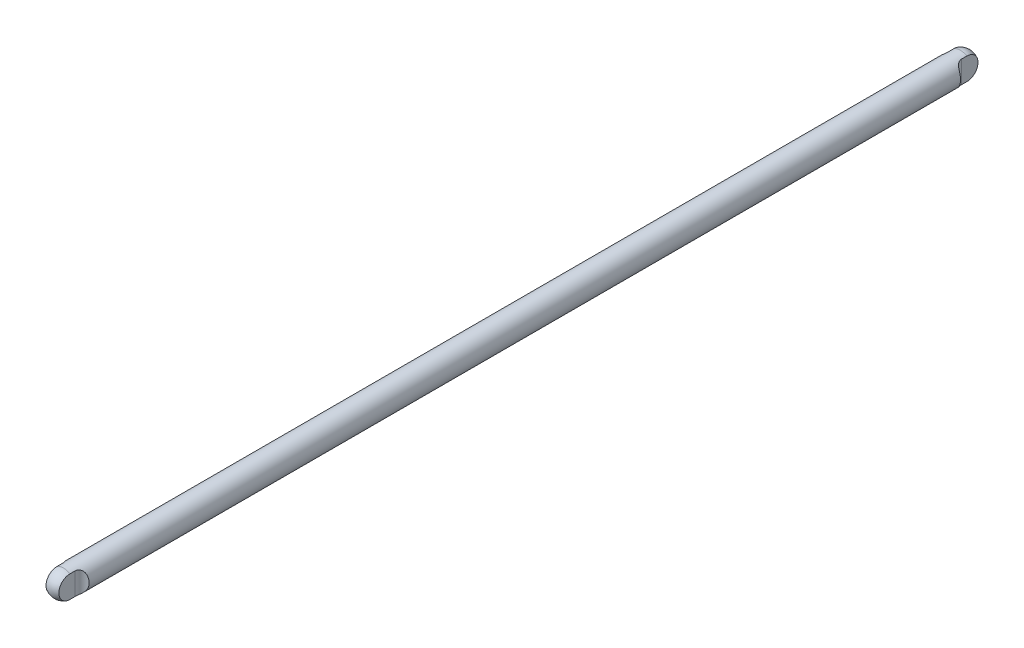
ISO-10303-21;
HEADER;
FILE_DESCRIPTION(('STEP AP214'),'2;1');
FILE_NAME('part.step','',(''),(''),'','','');
FILE_SCHEMA(('AUTOMOTIVE_DESIGN { 1 0 10303 214 1 1 1 1 }'));
ENDSEC;
DATA;
#1=APPLICATION_CONTEXT('core data for automotive mechanical design processes');
#2=APPLICATION_PROTOCOL_DEFINITION('international standard','automotive_design',2000,#1);
#3=PRODUCT_CONTEXT('',#1,'mechanical');
#4=PRODUCT('Part','Part','',(#3));
#5=PRODUCT_RELATED_PRODUCT_CATEGORY('part','',(#4));
#6=PRODUCT_DEFINITION_FORMATION('','',#4);
#7=PRODUCT_DEFINITION_CONTEXT('part definition',#1,'design');
#8=PRODUCT_DEFINITION('design','',#6,#7);
#9=PRODUCT_DEFINITION_SHAPE('','',#8);
#10=(LENGTH_UNIT() NAMED_UNIT(*) SI_UNIT(.MILLI.,.METRE.));
#11=(NAMED_UNIT(*) PLANE_ANGLE_UNIT() SI_UNIT($,.RADIAN.));
#12=(NAMED_UNIT(*) SI_UNIT($,.STERADIAN.) SOLID_ANGLE_UNIT());
#13=UNCERTAINTY_MEASURE_WITH_UNIT(LENGTH_MEASURE(1.E-05),#10,'distance_accuracy_value','');
#14=(GEOMETRIC_REPRESENTATION_CONTEXT(3) GLOBAL_UNCERTAINTY_ASSIGNED_CONTEXT((#13)) GLOBAL_UNIT_ASSIGNED_CONTEXT((#10,
#11,#12)) REPRESENTATION_CONTEXT('',''));
#15=CARTESIAN_POINT('',(0.,0.,0.));
#16=DIRECTION('',(0.,0.,1.));
#17=DIRECTION('',(1.,0.,0.));
#18=AXIS2_PLACEMENT_3D('',#15,#16,#17);
#19=CARTESIAN_POINT('',(0.,0.,349.1));
#20=DIRECTION('',(0.,0.,-1.));
#21=DIRECTION('',(-1.,0.,0.));
#22=AXIS2_PLACEMENT_3D('',#19,#20,#21);
#23=CYLINDRICAL_SURFACE('',#22,5.);
#24=DIRECTION('',(0.,0.,-1.));
#25=VECTOR('',#24,1.);
#26=CARTESIAN_POINT('',(2.5,-4.33012701892219,349.1));
#27=LINE('',#26,#25);
#28=CARTESIAN_POINT('',(2.5,-4.33012701892219,0.));
#29=VERTEX_POINT('',#28);
#30=CARTESIAN_POINT('',(2.5,-4.33012701892219,2.));
#31=VERTEX_POINT('',#30);
#32=EDGE_CURVE('E175',#29,#31,#27,.F.);
#33=ORIENTED_EDGE('',*,*,#32,.T.);
#34=CARTESIAN_POINT('',(2.5,-4.33012701892219,2.));
#35=CARTESIAN_POINT('',(2.49998890838741,-4.33011975918916,2.07286931336377));
#36=CARTESIAN_POINT('',(2.50265481474662,-4.32859389415641,2.14573595838383));
#37=CARTESIAN_POINT('',(2.51325772717459,-4.32245352122361,2.29095305502206));
#38=CARTESIAN_POINT('',(2.52119467837085,-4.31783904547655,2.36330351200592));
#39=CARTESIAN_POINT('',(2.54224982124621,-4.30547411184621,2.50693139415062));
#40=CARTESIAN_POINT('',(2.55536458210148,-4.29772573041024,2.57820949745524));
#41=CARTESIAN_POINT('',(2.58658931625948,-4.27900500507376,2.71920942895226));
#42=CARTESIAN_POINT('',(2.60469916857561,-4.26803273925885,2.78893129479424));
#43=CARTESIAN_POINT('',(2.66623556276672,-4.23007687808605,2.99513359796381));
#44=CARTESIAN_POINT('',(2.71686994066779,-4.19805367549162,3.12865739977181));
#45=CARTESIAN_POINT('',(2.83440227440243,-4.11960085236087,3.38358572054123));
#46=CARTESIAN_POINT('',(2.90129072758782,-4.07317964498852,3.50499726242607));
#47=CARTESIAN_POINT('',(3.04699289938735,-3.96534772585139,3.73231057695749));
#48=CARTESIAN_POINT('',(3.12575754221803,-3.90399809021093,3.83827280126846));
#49=CARTESIAN_POINT('',(3.29052014288885,-3.76616361967157,4.03335343987623));
#50=CARTESIAN_POINT('',(3.37651972438131,-3.68967538215664,4.12246805861374));
#51=CARTESIAN_POINT('',(3.55391210519017,-3.51928667337122,4.28645880636708));
#52=CARTESIAN_POINT('',(3.64538618990454,-3.42484054733495,4.36067521289881));
#53=CARTESIAN_POINT('',(3.82560456461646,-3.22228643681375,4.49175652627476));
#54=CARTESIAN_POINT('',(3.91434718350423,-3.11417028777206,4.54861099364463));
#55=CARTESIAN_POINT('',(4.06065278385769,-2.919153446362,4.63310374259887));
#56=CARTESIAN_POINT('',(4.11986962891962,-2.83503839357838,4.66444658606962));
#57=CARTESIAN_POINT('',(4.23390907705447,-2.66172259127331,4.72048729166151));
#58=CARTESIAN_POINT('',(4.28873006020074,-2.57251998746377,4.7451827119589));
#59=CARTESIAN_POINT('',(4.39324824982699,-2.38966226213723,4.78896360520669));
#60=CARTESIAN_POINT('',(4.44293698688549,-2.29600014198939,4.80803989836677));
#61=CARTESIAN_POINT('',(4.5365293918425,-2.1050433198745,4.84151264013937));
#62=CARTESIAN_POINT('',(4.58043352986605,-2.00774891393584,4.85590946920025));
#63=CARTESIAN_POINT('',(4.66287786393817,-1.80816501162143,4.88116695517961));
#64=CARTESIAN_POINT('',(4.70129351786299,-1.70581457761703,4.89195130225977));
#65=CARTESIAN_POINT('',(4.77140297442368,-1.49856073833942,4.91040545996588));
#66=CARTESIAN_POINT('',(4.80309619925755,-1.39365711447918,4.91807500292193));
#67=CARTESIAN_POINT('',(4.85952213794237,-1.18196065305939,4.93097708141289));
#68=CARTESIAN_POINT('',(4.88426176489115,-1.07516980483367,4.93621204076625));
#69=CARTESIAN_POINT('',(4.92667931168756,-0.860142880724481,4.94478607840418));
#70=CARTESIAN_POINT('',(4.94435779994534,-0.751906921895223,4.94812530930094));
#71=CARTESIAN_POINT('',(4.98200416493772,-0.461643601750666,4.95504556143226));
#72=CARTESIAN_POINT('',(4.99558372534604,-0.278717643035531,4.95729230473269));
#73=CARTESIAN_POINT('',(5.00258969913283,0.0875941668334869,4.95847844105652));
#74=CARTESIAN_POINT('',(4.99600800692065,0.270980173330969,4.95741650386152));
#75=CARTESIAN_POINT('',(4.96788288054121,0.579909917020618,4.95245038238301));
#76=CARTESIAN_POINT('',(4.95153983760421,0.705965186304049,4.94951643058023));
#77=CARTESIAN_POINT('',(4.90931314620836,0.95643621803914,4.94135312139897));
#78=CARTESIAN_POINT('',(4.88342740985525,1.08085161552009,4.93612326163934));
#79=CARTESIAN_POINT('',(4.82228758228391,1.32727971597429,4.9226160495179));
#80=CARTESIAN_POINT('',(4.78702730113114,1.44929077399684,4.91433668219431));
#81=CARTESIAN_POINT('',(4.70744994793621,1.68996101116523,4.89370956817255));
#82=CARTESIAN_POINT('',(4.66313477271953,1.80862088640329,4.88136267321175));
#83=CARTESIAN_POINT('',(4.57383870623748,2.02266390863234,4.85377535119704));
#84=CARTESIAN_POINT('',(4.53014423069972,2.11868798429218,4.83933484073116));
#85=CARTESIAN_POINT('',(4.4371340492809,2.30713626106005,4.8058438464872));
#86=CARTESIAN_POINT('',(4.38781938985173,2.39956112803791,4.78679422016546));
#87=CARTESIAN_POINT('',(4.28418192565815,2.58003656984942,4.74316257330849));
#88=CARTESIAN_POINT('',(4.22986663932654,2.66809341488229,4.71858878066347));
#89=CARTESIAN_POINT('',(4.11695515446838,2.83922589081871,4.66292080401462));
#90=CARTESIAN_POINT('',(4.05835999681569,2.92230272398227,4.63182820198133));
#91=CARTESIAN_POINT('',(3.90291532968622,3.12925861418026,4.54193061254306));
#92=CARTESIAN_POINT('',(3.80355543688568,3.24892003284708,4.4775023769547));
#93=CARTESIAN_POINT('',(3.60203769768729,3.47098996337275,4.32668739870024));
#94=CARTESIAN_POINT('',(3.49988150682769,3.57340843755407,4.2403134083514));
#95=CARTESIAN_POINT('',(3.34974774028792,3.71267559127453,4.09318082396465));
#96=CARTESIAN_POINT('',(3.30002753755786,3.75685190332047,4.0409637131228));
#97=CARTESIAN_POINT('',(3.20274304260355,3.84011951962084,3.93080258866227));
#98=CARTESIAN_POINT('',(3.15517777842065,3.87921313154574,3.87286119518595));
#99=CARTESIAN_POINT('',(3.06318120877645,3.95226256007617,3.75148829460892));
#100=CARTESIAN_POINT('',(3.01875030213194,3.98621772349087,3.68805609113419));
#101=CARTESIAN_POINT('',(2.93397379754708,4.04902189933137,3.55617047051652));
#102=CARTESIAN_POINT('',(2.89362771797114,4.0778715140452,3.48771764699217));
#103=CARTESIAN_POINT('',(2.78866019712116,4.15091266051016,3.29179521959217));
#104=CARTESIAN_POINT('',(2.72925460124386,4.18982276345876,3.15945205454181));
#105=CARTESIAN_POINT('',(2.62964362505587,4.25305647096754,2.88455644879689));
#106=CARTESIAN_POINT('',(2.58942933216935,4.27738684779975,2.74200878258537));
#107=CARTESIAN_POINT('',(2.54007860241238,4.30680074197868,2.49882771096457));
#108=CARTESIAN_POINT('',(2.52507536549459,4.31557944456009,2.39977873925277));
#109=CARTESIAN_POINT('',(2.5050279075174,4.32722457844035,2.20049865292886));
#110=CARTESIAN_POINT('',(2.49996745460086,4.3301006462887,2.10026973422495));
#111=CARTESIAN_POINT('',(2.5,4.33012701892219,2.));
#112=B_SPLINE_CURVE_WITH_KNOTS('',3,(#34,#35,#36,#37,#38,#39,#40,#41,#42,#43,#44,#45,#46,#47,
#48,#49,#50,#51,#52,#53,#54,#55,#56,#57,#58,#59,#60,#61,#62,#63,#64,#65,#66,#67,#68,#69,#70,#71,
#72,#73,#74,#75,#76,#77,#78,#79,#80,#81,#82,#83,#84,#85,#86,#87,#88,#89,#90,#91,#92,#93,#94,#95,
#96,#97,#98,#99,#100,#101,#102,#103,#104,#105,#106,#107,#108,#109,#110,#111),.UNSPECIFIED.,.F.,
.F.,(4,2,2,2,2,2,2,2,2,2,2,2,2,2,2,2,2,2,2,2,2,2,2,2,2,2,2,2,2,2,2,2,2,2,2,2,2,2,4),(0.,
0.218538284869025,0.437074294751238,0.655465744738902,0.873851905510304,1.31060421849003,
1.74710180393741,2.18184273331704,2.61668148809694,3.06783629085049,3.51926183451306,
3.84147094255838,4.16379824790588,4.4866492453154,4.80947398782153,5.1387416935797,
5.46803768889111,5.79700513873042,6.12594610188647,6.67506732433646,7.2244093433822,
7.6054845080682,7.98664309965389,8.36805399486516,8.74938507361984,9.06854671962465,
9.3876490360193,9.70627918259163,10.0248320940086,10.5277774805773,11.0304312795866,
11.2837910871098,11.5370354583472,11.7903119945858,12.0435586325186,12.4917160669609,
12.9396651709179,13.240717680691,13.5412783045895),.UNSPECIFIED.);
#113=CARTESIAN_POINT('',(2.5,4.33012701892219,2.));
#114=VERTEX_POINT('',#113);
#115=EDGE_CURVE('E163',#31,#114,#112,.T.);
#116=ORIENTED_EDGE('',*,*,#115,.T.);
#117=DIRECTION('',(0.,0.,-1.));
#118=VECTOR('',#117,1.);
#119=CARTESIAN_POINT('',(2.5,4.33012701892219,349.1));
#120=LINE('',#119,#118);
#121=CARTESIAN_POINT('',(2.5,4.33012701892219,0.));
#122=VERTEX_POINT('',#121);
#123=EDGE_CURVE('E178',#114,#122,#120,.T.);
#124=ORIENTED_EDGE('',*,*,#123,.T.);
#125=CARTESIAN_POINT('',(0.,0.,0.));
#126=DIRECTION('',(0.,0.,1.));
#127=DIRECTION('',(1.,0.,0.));
#128=AXIS2_PLACEMENT_3D('',#125,#126,#127);
#129=CIRCLE('',#128,5.);
#130=CARTESIAN_POINT('',(-2.5,4.33012701892219,0.));
#131=VERTEX_POINT('',#130);
#132=EDGE_CURVE('E186',#122,#131,#129,.T.);
#133=ORIENTED_EDGE('',*,*,#132,.T.);
#134=DIRECTION('',(0.,0.,-1.));
#135=VECTOR('',#134,1.);
#136=CARTESIAN_POINT('',(-2.5,4.33012701892219,349.1));
#137=LINE('',#136,#135);
#138=CARTESIAN_POINT('',(-2.5,4.33012701892219,2.));
#139=VERTEX_POINT('',#138);
#140=EDGE_CURVE('E185',#139,#131,#137,.T.);
#141=ORIENTED_EDGE('',*,*,#140,.F.);
#142=CARTESIAN_POINT('',(-2.5,4.33012701892219,2.));
#143=CARTESIAN_POINT('',(-2.49998890838741,4.33011975918916,2.07286931336377));
#144=CARTESIAN_POINT('',(-2.50265481474662,4.32859389415641,2.14573595838383));
#145=CARTESIAN_POINT('',(-2.51325772717459,4.32245352122361,2.29095305502206));
#146=CARTESIAN_POINT('',(-2.52119467837085,4.31783904547655,2.36330351200592));
#147=CARTESIAN_POINT('',(-2.54224982124621,4.30547411184621,2.50693139415062));
#148=CARTESIAN_POINT('',(-2.55536458210148,4.29772573041024,2.57820949745524));
#149=CARTESIAN_POINT('',(-2.58658931625948,4.27900500507376,2.71920942895226));
#150=CARTESIAN_POINT('',(-2.60469916857561,4.26803273925885,2.78893129479424));
#151=CARTESIAN_POINT('',(-2.66623556276672,4.23007687808605,2.99513359796381));
#152=CARTESIAN_POINT('',(-2.71686994066779,4.19805367549162,3.12865739977181));
#153=CARTESIAN_POINT('',(-2.83440227440243,4.11960085236087,3.38358572054123));
#154=CARTESIAN_POINT('',(-2.90129072758782,4.07317964498852,3.50499726242607));
#155=CARTESIAN_POINT('',(-3.04699289938735,3.96534772585139,3.73231057695749));
#156=CARTESIAN_POINT('',(-3.12575754221803,3.90399809021093,3.83827280126846));
#157=CARTESIAN_POINT('',(-3.29052014288885,3.76616361967157,4.03335343987623));
#158=CARTESIAN_POINT('',(-3.37651972438131,3.68967538215664,4.12246805861374));
#159=CARTESIAN_POINT('',(-3.55391210519017,3.51928667337122,4.28645880636708));
#160=CARTESIAN_POINT('',(-3.64538618990454,3.42484054733495,4.36067521289881));
#161=CARTESIAN_POINT('',(-3.82560456461646,3.22228643681375,4.49175652627476));
#162=CARTESIAN_POINT('',(-3.91434718350423,3.11417028777206,4.54861099364463));
#163=CARTESIAN_POINT('',(-4.06065278385769,2.919153446362,4.63310374259887));
#164=CARTESIAN_POINT('',(-4.11986962891962,2.83503839357838,4.66444658606962));
#165=CARTESIAN_POINT('',(-4.23390907705447,2.66172259127331,4.72048729166151));
#166=CARTESIAN_POINT('',(-4.28873006020074,2.57251998746377,4.7451827119589));
#167=CARTESIAN_POINT('',(-4.39324824982699,2.38966226213723,4.78896360520669));
#168=CARTESIAN_POINT('',(-4.44293698688549,2.29600014198939,4.80803989836677));
#169=CARTESIAN_POINT('',(-4.5365293918425,2.1050433198745,4.84151264013937));
#170=CARTESIAN_POINT('',(-4.58043352986605,2.00774891393584,4.85590946920025));
#171=CARTESIAN_POINT('',(-4.66287786393817,1.80816501162143,4.88116695517961));
#172=CARTESIAN_POINT('',(-4.70129351786299,1.70581457761703,4.89195130225977));
#173=CARTESIAN_POINT('',(-4.77140297442368,1.49856073833942,4.91040545996588));
#174=CARTESIAN_POINT('',(-4.80309619925755,1.39365711447918,4.91807500292193));
#175=CARTESIAN_POINT('',(-4.85952213794237,1.18196065305939,4.93097708141289));
#176=CARTESIAN_POINT('',(-4.88426176489115,1.07516980483367,4.93621204076625));
#177=CARTESIAN_POINT('',(-4.92667931168756,0.86014288072448,4.94478607840418));
#178=CARTESIAN_POINT('',(-4.94435779994534,0.751906921895222,4.94812530930094));
#179=CARTESIAN_POINT('',(-4.98200416493772,0.461643601750665,4.95504556143226));
#180=CARTESIAN_POINT('',(-4.99558372534604,0.27871764303553,4.9572923047327));
#181=CARTESIAN_POINT('',(-5.00258969913283,-0.0875941668334893,4.95847844105652));
#182=CARTESIAN_POINT('',(-4.99600800692065,-0.270980173330972,4.95741650386152));
#183=CARTESIAN_POINT('',(-4.96788288054121,-0.579909917020621,4.95245038238301));
#184=CARTESIAN_POINT('',(-4.95153983760421,-0.705965186304052,4.94951643058023));
#185=CARTESIAN_POINT('',(-4.90931314620836,-0.956436218039144,4.94135312139897));
#186=CARTESIAN_POINT('',(-4.88342740985525,-1.08085161552009,4.93612326163934));
#187=CARTESIAN_POINT('',(-4.82228758228391,-1.32727971597429,4.9226160495179));
#188=CARTESIAN_POINT('',(-4.78702730113114,-1.44929077399685,4.91433668219431));
#189=CARTESIAN_POINT('',(-4.70744994793621,-1.68996101116524,4.89370956817255));
#190=CARTESIAN_POINT('',(-4.66313477271953,-1.80862088640329,4.88136267321175));
#191=CARTESIAN_POINT('',(-4.57383870623748,-2.02266390863235,4.85377535119704));
#192=CARTESIAN_POINT('',(-4.53014423069972,-2.11868798429218,4.83933484073116));
#193=CARTESIAN_POINT('',(-4.4371340492809,-2.30713626106005,4.8058438464872));
#194=CARTESIAN_POINT('',(-4.38781938985173,-2.39956112803791,4.78679422016546));
#195=CARTESIAN_POINT('',(-4.28418192565815,-2.58003656984943,4.7431625733085));
#196=CARTESIAN_POINT('',(-4.22986663932653,-2.6680934148823,4.71858878066347));
#197=CARTESIAN_POINT('',(-4.11695515446838,-2.83922589081872,4.66292080401462));
#198=CARTESIAN_POINT('',(-4.05835999681569,-2.92230272398227,4.63182820198133));
#199=CARTESIAN_POINT('',(-3.90291532968622,-3.12925861418026,4.54193061254306));
#200=CARTESIAN_POINT('',(-3.80355543688568,-3.24892003284708,4.4775023769547));
#201=CARTESIAN_POINT('',(-3.60203769768728,-3.47098996337275,4.32668739870024));
#202=CARTESIAN_POINT('',(-3.49988150682769,-3.57340843755407,4.2403134083514));
#203=CARTESIAN_POINT('',(-3.34974774028792,-3.71267559127453,4.09318082396465));
#204=CARTESIAN_POINT('',(-3.30002753755786,-3.75685190332048,4.0409637131228));
#205=CARTESIAN_POINT('',(-3.20274304260354,-3.84011951962085,3.93080258866227));
#206=CARTESIAN_POINT('',(-3.15517777842065,-3.87921313154574,3.87286119518594));
#207=CARTESIAN_POINT('',(-3.06318120877645,-3.95226256007617,3.75148829460891));
#208=CARTESIAN_POINT('',(-3.01875030213194,-3.98621772349087,3.68805609113418));
#209=CARTESIAN_POINT('',(-2.93397379754708,-4.04902189933137,3.55617047051652));
#210=CARTESIAN_POINT('',(-2.89362771797114,-4.0778715140452,3.48771764699216));
#211=CARTESIAN_POINT('',(-2.78866019712116,-4.15091266051016,3.29179521959217));
#212=CARTESIAN_POINT('',(-2.72925460124385,-4.18982276345876,3.1594520545418));
#213=CARTESIAN_POINT('',(-2.62964362505587,-4.25305647096754,2.88455644879689));
#214=CARTESIAN_POINT('',(-2.58942933216935,-4.27738684779975,2.74200878258536));
#215=CARTESIAN_POINT('',(-2.54007860241238,-4.30680074197868,2.49882771096457));
#216=CARTESIAN_POINT('',(-2.52507536549459,-4.31557944456009,2.39977873925276));
#217=CARTESIAN_POINT('',(-2.5050279075174,-4.32722457844035,2.20049865292886));
#218=CARTESIAN_POINT('',(-2.49996745460086,-4.3301006462887,2.10026973422495));
#219=CARTESIAN_POINT('',(-2.5,-4.33012701892219,2.));
#220=B_SPLINE_CURVE_WITH_KNOTS('',3,(#142,#143,#144,#145,#146,#147,#148,#149,#150,#151,#152,
#153,#154,#155,#156,#157,#158,#159,#160,#161,#162,#163,#164,#165,#166,#167,#168,#169,#170,#171,
#172,#173,#174,#175,#176,#177,#178,#179,#180,#181,#182,#183,#184,#185,#186,#187,#188,#189,#190,
#191,#192,#193,#194,#195,#196,#197,#198,#199,#200,#201,#202,#203,#204,#205,#206,#207,#208,#209,
#210,#211,#212,#213,#214,#215,#216,#217,#218,#219),.UNSPECIFIED.,.F.,.F.,(4,2,2,2,2,2,2,2,2,2,2,
2,2,2,2,2,2,2,2,2,2,2,2,2,2,2,2,2,2,2,2,2,2,2,2,2,2,2,4),(0.,0.218538284869025,
0.437074294751238,0.655465744738902,0.873851905510304,1.31060421849003,1.74710180393741,
2.18184273331704,2.61668148809694,3.06783629085049,3.51926183451306,3.84147094255838,
4.16379824790588,4.4866492453154,4.80947398782153,5.1387416935797,5.4680376888911,
5.79700513873042,6.12594610188647,6.67506732433646,7.2244093433822,7.6054845080682,
7.98664309965389,8.36805399486516,8.74938507361984,9.06854671962465,9.3876490360193,
9.70627918259163,10.0248320940086,10.5277774805773,11.0304312795866,11.2837910871098,
11.5370354583472,11.7903119945858,12.0435586325186,12.4917160669609,12.9396651709179,
13.240717680691,13.5412783045895),.UNSPECIFIED.);
#221=CARTESIAN_POINT('',(-2.5,-4.33012701892219,2.));
#222=VERTEX_POINT('',#221);
#223=EDGE_CURVE('E140',#139,#222,#220,.T.);
#224=ORIENTED_EDGE('',*,*,#223,.T.);
#225=DIRECTION('',(0.,0.,-1.));
#226=VECTOR('',#225,1.);
#227=CARTESIAN_POINT('',(-2.5,-4.33012701892219,349.1));
#228=LINE('',#227,#226);
#229=CARTESIAN_POINT('',(-2.5,-4.33012701892219,0.));
#230=VERTEX_POINT('',#229);
#231=EDGE_CURVE('E183',#230,#222,#228,.F.);
#232=ORIENTED_EDGE('',*,*,#231,.F.);
#233=EDGE_CURVE('E131',#230,#29,#129,.T.);
#234=ORIENTED_EDGE('',*,*,#233,.T.);
#235=EDGE_LOOP('',(#33,#116,#124,#133,#141,#224,#232,#234));
#236=FACE_BOUND('',#235,.T.);
#237=DIRECTION('',(0.,0.,-1.));
#238=VECTOR('',#237,1.);
#239=CARTESIAN_POINT('',(-2.5,4.33012701892219,349.1));
#240=LINE('',#239,#238);
#241=CARTESIAN_POINT('',(-2.5,4.33012701892219,349.1));
#242=VERTEX_POINT('',#241);
#243=CARTESIAN_POINT('',(-2.5,4.33012701892219,347.1));
#244=VERTEX_POINT('',#243);
#245=EDGE_CURVE('E107',#242,#244,#240,.T.);
#246=ORIENTED_EDGE('',*,*,#245,.F.);
#247=CARTESIAN_POINT('',(0.,0.,349.1));
#248=DIRECTION('',(0.,0.,1.));
#249=DIRECTION('',(1.,0.,0.));
#250=AXIS2_PLACEMENT_3D('',#247,#248,#249);
#251=CIRCLE('',#250,5.);
#252=CARTESIAN_POINT('',(2.5,4.33012701892219,349.1));
#253=VERTEX_POINT('',#252);
#254=EDGE_CURVE('E119',#253,#242,#251,.T.);
#255=ORIENTED_EDGE('',*,*,#254,.F.);
#256=DIRECTION('',(0.,0.,-1.));
#257=VECTOR('',#256,1.);
#258=CARTESIAN_POINT('',(2.5,4.33012701892219,349.1));
#259=LINE('',#258,#257);
#260=CARTESIAN_POINT('',(2.5,4.33012701892219,347.1));
#261=VERTEX_POINT('',#260);
#262=EDGE_CURVE('E174',#253,#261,#259,.T.);
#263=ORIENTED_EDGE('',*,*,#262,.T.);
#264=CARTESIAN_POINT('',(2.5,4.33012701892219,347.1));
#265=CARTESIAN_POINT('',(2.49998890838741,4.33011975918917,347.027130686636));
#266=CARTESIAN_POINT('',(2.50265481474661,4.32859389415641,346.954264041616));
#267=CARTESIAN_POINT('',(2.51325772717459,4.32245352122361,346.809046944978));
#268=CARTESIAN_POINT('',(2.52119467837085,4.31783904547654,346.736696487994));
#269=CARTESIAN_POINT('',(2.54224982124621,4.30547411184621,346.593068605849));
#270=CARTESIAN_POINT('',(2.55536458210148,4.29772573041024,346.521790502545));
#271=CARTESIAN_POINT('',(2.58658931625948,4.27900500507376,346.380790571048));
#272=CARTESIAN_POINT('',(2.60469916857561,4.26803273925885,346.311068705206));
#273=CARTESIAN_POINT('',(2.66623556276672,4.23007687808606,346.104866402036));
#274=CARTESIAN_POINT('',(2.71686994066779,4.19805367549163,345.971342600228));
#275=CARTESIAN_POINT('',(2.83440227440242,4.11960085236088,345.716414279459));
#276=CARTESIAN_POINT('',(2.90129072758782,4.07317964498851,345.595002737574));
#277=CARTESIAN_POINT('',(3.04699289938736,3.96534772585139,345.367689423043));
#278=CARTESIAN_POINT('',(3.12575754221803,3.90399809021093,345.261727198732));
#279=CARTESIAN_POINT('',(3.29052014288884,3.76616361967158,345.066646560124));
#280=CARTESIAN_POINT('',(3.37651972438129,3.68967538215665,344.977531941386));
#281=CARTESIAN_POINT('',(3.55391210519015,3.51928667337123,344.813541193633));
#282=CARTESIAN_POINT('',(3.64538618990452,3.42484054733496,344.739324787101));
#283=CARTESIAN_POINT('',(3.82560456461645,3.22228643681376,344.608243473725));
#284=CARTESIAN_POINT('',(3.91434718350422,3.11417028777207,344.551389006355));
#285=CARTESIAN_POINT('',(4.06065278385769,2.919153446362,344.466896257401));
#286=CARTESIAN_POINT('',(4.11986962891962,2.83503839357839,344.43555341393));
#287=CARTESIAN_POINT('',(4.23390907705447,2.66172259127331,344.379512708338));
#288=CARTESIAN_POINT('',(4.28873006020074,2.57251998746377,344.354817288041));
#289=CARTESIAN_POINT('',(4.39324824982699,2.38966226213723,344.311036394793));
#290=CARTESIAN_POINT('',(4.44293698688549,2.29600014198939,344.291960101633));
#291=CARTESIAN_POINT('',(4.53652939184249,2.10504331987451,344.258487359861));
#292=CARTESIAN_POINT('',(4.58043352986605,2.00774891393585,344.2440905308));
#293=CARTESIAN_POINT('',(4.66287786393817,1.80816501162144,344.21883304482));
#294=CARTESIAN_POINT('',(4.70129351786298,1.70581457761704,344.20804869774));
#295=CARTESIAN_POINT('',(4.77140297442367,1.49856073833943,344.189594540034));
#296=CARTESIAN_POINT('',(4.80309619925755,1.39365711447919,344.181924997078));
#297=CARTESIAN_POINT('',(4.85952213794237,1.1819606530594,344.169022918587));
#298=CARTESIAN_POINT('',(4.88426176489115,1.07516980483369,344.163787959234));
#299=CARTESIAN_POINT('',(4.92667931168755,0.860142880724499,344.155213921596));
#300=CARTESIAN_POINT('',(4.94435779994533,0.75190692189524,344.151874690699));
#301=CARTESIAN_POINT('',(4.98200416493772,0.461643601750679,344.144954438568));
#302=CARTESIAN_POINT('',(4.99558372534604,0.278717643035542,344.142707695267));
#303=CARTESIAN_POINT('',(5.00258969913283,-0.0875941668334814,344.141521558944));
#304=CARTESIAN_POINT('',(4.99600800692065,-0.270980173330966,344.142583496139));
#305=CARTESIAN_POINT('',(4.96788288054121,-0.579909917020619,344.147549617617));
#306=CARTESIAN_POINT('',(4.95153983760421,-0.705965186304051,344.15048356942));
#307=CARTESIAN_POINT('',(4.90931314620836,-0.956436218039144,344.158646878601));
#308=CARTESIAN_POINT('',(4.88342740985525,-1.08085161552009,344.163876738361));
#309=CARTESIAN_POINT('',(4.82228758228391,-1.32727971597429,344.177383950482));
#310=CARTESIAN_POINT('',(4.78702730113114,-1.44929077399685,344.185663317806));
#311=CARTESIAN_POINT('',(4.70744994793621,-1.68996101116524,344.206290431827));
#312=CARTESIAN_POINT('',(4.66313477271953,-1.80862088640329,344.218637326788));
#313=CARTESIAN_POINT('',(4.57383870623748,-2.02266390863234,344.246224648803));
#314=CARTESIAN_POINT('',(4.53014423069972,-2.11868798429218,344.260665159269));
#315=CARTESIAN_POINT('',(4.4371340492809,-2.30713626106004,344.294156153513));
#316=CARTESIAN_POINT('',(4.38781938985173,-2.3995611280379,344.313205779835));
#317=CARTESIAN_POINT('',(4.28418192565815,-2.58003656984942,344.356837426692));
#318=CARTESIAN_POINT('',(4.22986663932654,-2.66809341488229,344.381411219337));
#319=CARTESIAN_POINT('',(4.11695515446838,-2.83922589081872,344.437079195985));
#320=CARTESIAN_POINT('',(4.05835999681569,-2.92230272398227,344.468171798019));
#321=CARTESIAN_POINT('',(3.90291532968622,-3.12925861418026,344.558069387457));
#322=CARTESIAN_POINT('',(3.80355543688567,-3.24892003284709,344.622497623045));
#323=CARTESIAN_POINT('',(3.60203769768727,-3.47098996337276,344.7733126013));
#324=CARTESIAN_POINT('',(3.49988150682768,-3.57340843755408,344.859686591649));
#325=CARTESIAN_POINT('',(3.3497477402879,-3.71267559127454,345.006819176035));
#326=CARTESIAN_POINT('',(3.30002753755784,-3.75685190332049,345.059036286877));
#327=CARTESIAN_POINT('',(3.20274304260351,-3.84011951962087,345.169197411338));
#328=CARTESIAN_POINT('',(3.15517777842061,-3.87921313154577,345.227138804814));
#329=CARTESIAN_POINT('',(3.0631812087764,-3.95226256007621,345.348511705391));
#330=CARTESIAN_POINT('',(3.01875030213188,-3.98621772349091,345.411943908866));
#331=CARTESIAN_POINT('',(2.93397379754703,-4.04902189933141,345.543829529484));
#332=CARTESIAN_POINT('',(2.8936277179711,-4.07787151404523,345.612282353008));
#333=CARTESIAN_POINT('',(2.78866019712113,-4.15091266051018,345.808204780408));
#334=CARTESIAN_POINT('',(2.72925460124383,-4.18982276345878,345.940547945458));
#335=CARTESIAN_POINT('',(2.62964362505585,-4.25305647096756,346.215443551203));
#336=CARTESIAN_POINT('',(2.58942933216933,-4.27738684779977,346.357991217415));
#337=CARTESIAN_POINT('',(2.54007860241237,-4.30680074197869,346.601172289036));
#338=CARTESIAN_POINT('',(2.52507536549458,-4.3155794445601,346.700221260747));
#339=CARTESIAN_POINT('',(2.5050279075174,-4.32722457844035,346.899501347071));
#340=CARTESIAN_POINT('',(2.49996745460087,-4.3301006462887,346.999730265775));
#341=CARTESIAN_POINT('',(2.5,-4.33012701892219,347.1));
#342=B_SPLINE_CURVE_WITH_KNOTS('',3,(#264,#265,#266,#267,#268,#269,#270,#271,#272,#273,#274,
#275,#276,#277,#278,#279,#280,#281,#282,#283,#284,#285,#286,#287,#288,#289,#290,#291,#292,#293,
#294,#295,#296,#297,#298,#299,#300,#301,#302,#303,#304,#305,#306,#307,#308,#309,#310,#311,#312,
#313,#314,#315,#316,#317,#318,#319,#320,#321,#322,#323,#324,#325,#326,#327,#328,#329,#330,#331,
#332,#333,#334,#335,#336,#337,#338,#339,#340,#341),.UNSPECIFIED.,.F.,.F.,(4,2,2,2,2,2,2,2,2,2,2,
2,2,2,2,2,2,2,2,2,2,2,2,2,2,2,2,2,2,2,2,2,2,2,2,2,2,2,4),(0.,0.218538284869038,
0.437074294751231,0.65546574473891,0.873851905510292,1.31060421849,1.7471018039374,
2.18184273331705,2.61668148809692,3.06783629085048,3.51926183451304,3.84147094255839,
4.16379824790588,4.4866492453154,4.80947398782152,5.13874169357969,5.46803768889109,
5.7970051387304,6.12594610188645,6.67506732433645,7.2244093433822,7.6054845080682,
7.9866430996539,8.36805399486516,8.74938507361984,9.06854671962464,9.38764903601929,
9.70627918259164,10.0248320940086,10.5277774805773,11.0304312795866,11.2837910871098,
11.5370354583473,11.7903119945859,12.0435586325187,12.491716066961,12.939665170918,
13.240717680691,13.5412783045895),.UNSPECIFIED.);
#343=CARTESIAN_POINT('',(2.5,-4.33012701892219,347.1));
#344=VERTEX_POINT('',#343);
#345=EDGE_CURVE('E11',#261,#344,#342,.T.);
#346=ORIENTED_EDGE('',*,*,#345,.T.);
#347=DIRECTION('',(0.,0.,-1.));
#348=VECTOR('',#347,1.);
#349=CARTESIAN_POINT('',(2.5,-4.33012701892219,349.1));
#350=LINE('',#349,#348);
#351=CARTESIAN_POINT('',(2.5,-4.33012701892219,349.1));
#352=VERTEX_POINT('',#351);
#353=EDGE_CURVE('E121',#344,#352,#350,.F.);
#354=ORIENTED_EDGE('',*,*,#353,.T.);
#355=CARTESIAN_POINT('',(-2.5,-4.33012701892219,349.1));
#356=VERTEX_POINT('',#355);
#357=EDGE_CURVE('E127',#356,#352,#251,.T.);
#358=ORIENTED_EDGE('',*,*,#357,.F.);
#359=DIRECTION('',(0.,0.,-1.));
#360=VECTOR('',#359,1.);
#361=CARTESIAN_POINT('',(-2.5,-4.33012701892219,349.1));
#362=LINE('',#361,#360);
#363=CARTESIAN_POINT('',(-2.5,-4.33012701892219,347.1));
#364=VERTEX_POINT('',#363);
#365=EDGE_CURVE('E110',#364,#356,#362,.F.);
#366=ORIENTED_EDGE('',*,*,#365,.F.);
#367=CARTESIAN_POINT('',(-2.5,-4.33012701892219,347.1));
#368=CARTESIAN_POINT('',(-2.49998890838741,-4.33011975918917,347.027130686636));
#369=CARTESIAN_POINT('',(-2.50265481474661,-4.32859389415641,346.954264041616));
#370=CARTESIAN_POINT('',(-2.51325772717459,-4.32245352122361,346.809046944978));
#371=CARTESIAN_POINT('',(-2.52119467837085,-4.31783904547654,346.736696487994));
#372=CARTESIAN_POINT('',(-2.54224982124621,-4.30547411184621,346.593068605849));
#373=CARTESIAN_POINT('',(-2.55536458210148,-4.29772573041024,346.521790502545));
#374=CARTESIAN_POINT('',(-2.58658931625948,-4.27900500507376,346.380790571048));
#375=CARTESIAN_POINT('',(-2.60469916857561,-4.26803273925885,346.311068705206));
#376=CARTESIAN_POINT('',(-2.66623556276672,-4.23007687808606,346.104866402036));
#377=CARTESIAN_POINT('',(-2.71686994066779,-4.19805367549163,345.971342600228));
#378=CARTESIAN_POINT('',(-2.83440227440242,-4.11960085236088,345.716414279459));
#379=CARTESIAN_POINT('',(-2.90129072758782,-4.07317964498851,345.595002737574));
#380=CARTESIAN_POINT('',(-3.04699289938736,-3.96534772585139,345.367689423043));
#381=CARTESIAN_POINT('',(-3.12575754221803,-3.90399809021093,345.261727198732));
#382=CARTESIAN_POINT('',(-3.29052014288884,-3.76616361967158,345.066646560124));
#383=CARTESIAN_POINT('',(-3.37651972438129,-3.68967538215665,344.977531941386));
#384=CARTESIAN_POINT('',(-3.55391210519015,-3.51928667337123,344.813541193633));
#385=CARTESIAN_POINT('',(-3.64538618990452,-3.42484054733496,344.739324787101));
#386=CARTESIAN_POINT('',(-3.82560456461645,-3.22228643681376,344.608243473725));
#387=CARTESIAN_POINT('',(-3.91434718350422,-3.11417028777207,344.551389006355));
#388=CARTESIAN_POINT('',(-4.06065278385769,-2.919153446362,344.466896257401));
#389=CARTESIAN_POINT('',(-4.11986962891962,-2.83503839357839,344.43555341393));
#390=CARTESIAN_POINT('',(-4.23390907705447,-2.66172259127331,344.379512708338));
#391=CARTESIAN_POINT('',(-4.28873006020074,-2.57251998746377,344.354817288041));
#392=CARTESIAN_POINT('',(-4.39324824982699,-2.38966226213723,344.311036394793));
#393=CARTESIAN_POINT('',(-4.44293698688549,-2.29600014198939,344.291960101633));
#394=CARTESIAN_POINT('',(-4.53652939184249,-2.10504331987451,344.258487359861));
#395=CARTESIAN_POINT('',(-4.58043352986605,-2.00774891393585,344.2440905308));
#396=CARTESIAN_POINT('',(-4.66287786393817,-1.80816501162144,344.21883304482));
#397=CARTESIAN_POINT('',(-4.70129351786298,-1.70581457761704,344.20804869774));
#398=CARTESIAN_POINT('',(-4.77140297442368,-1.49856073833943,344.189594540034));
#399=CARTESIAN_POINT('',(-4.80309619925755,-1.39365711447919,344.181924997078));
#400=CARTESIAN_POINT('',(-4.85952213794237,-1.1819606530594,344.169022918587));
#401=CARTESIAN_POINT('',(-4.88426176489115,-1.07516980483369,344.163787959234));
#402=CARTESIAN_POINT('',(-4.92667931168755,-0.860142880724499,344.155213921596));
#403=CARTESIAN_POINT('',(-4.94435779994533,-0.75190692189524,344.151874690699));
#404=CARTESIAN_POINT('',(-4.98200416493772,-0.461643601750679,344.144954438568));
#405=CARTESIAN_POINT('',(-4.99558372534604,-0.278717643035543,344.142707695267));
#406=CARTESIAN_POINT('',(-5.00258969913283,0.0875941668334803,344.141521558944));
#407=CARTESIAN_POINT('',(-4.99600800692065,0.270980173330965,344.142583496139));
#408=CARTESIAN_POINT('',(-4.96788288054121,0.579909917020618,344.147549617617));
#409=CARTESIAN_POINT('',(-4.95153983760421,0.70596518630405,344.15048356942));
#410=CARTESIAN_POINT('',(-4.90931314620836,0.956436218039142,344.158646878601));
#411=CARTESIAN_POINT('',(-4.88342740985525,1.08085161552009,344.163876738361));
#412=CARTESIAN_POINT('',(-4.82228758228391,1.32727971597429,344.177383950482));
#413=CARTESIAN_POINT('',(-4.78702730113114,1.44929077399685,344.185663317806));
#414=CARTESIAN_POINT('',(-4.70744994793621,1.68996101116523,344.206290431827));
#415=CARTESIAN_POINT('',(-4.66313477271953,1.80862088640329,344.218637326788));
#416=CARTESIAN_POINT('',(-4.57383870623748,2.02266390863234,344.246224648803));
#417=CARTESIAN_POINT('',(-4.53014423069972,2.11868798429218,344.260665159269));
#418=CARTESIAN_POINT('',(-4.4371340492809,2.30713626106004,344.294156153513));
#419=CARTESIAN_POINT('',(-4.38781938985173,2.3995611280379,344.313205779835));
#420=CARTESIAN_POINT('',(-4.28418192565815,2.58003656984942,344.356837426692));
#421=CARTESIAN_POINT('',(-4.22986663932654,2.66809341488229,344.381411219337));
#422=CARTESIAN_POINT('',(-4.11695515446838,2.83922589081871,344.437079195985));
#423=CARTESIAN_POINT('',(-4.0583599968157,2.92230272398226,344.468171798019));
#424=CARTESIAN_POINT('',(-3.90291532968622,3.12925861418026,344.558069387457));
#425=CARTESIAN_POINT('',(-3.80355543688567,3.24892003284709,344.622497623045));
#426=CARTESIAN_POINT('',(-3.60203769768728,3.47098996337275,344.7733126013));
#427=CARTESIAN_POINT('',(-3.49988150682769,3.57340843755407,344.859686591649));
#428=CARTESIAN_POINT('',(-3.34974774028789,3.71267559127455,345.006819176035));
#429=CARTESIAN_POINT('',(-3.30002753755781,3.75685190332052,345.059036286877));
#430=CARTESIAN_POINT('',(-3.20274304260349,3.84011951962089,345.169197411338));
#431=CARTESIAN_POINT('',(-3.1551777784206,3.87921313154577,345.227138804814));
#432=CARTESIAN_POINT('',(-3.06318120877642,3.95226256007619,345.348511705391));
#433=CARTESIAN_POINT('',(-3.0187503021319,3.9862177234909,345.411943908866));
#434=CARTESIAN_POINT('',(-2.93397379754705,4.0490218993314,345.543829529484));
#435=CARTESIAN_POINT('',(-2.89362771797111,4.07787151404521,345.612282353008));
#436=CARTESIAN_POINT('',(-2.78866019712114,4.15091266051017,345.808204780408));
#437=CARTESIAN_POINT('',(-2.72925460124385,4.18982276345876,345.940547945458));
#438=CARTESIAN_POINT('',(-2.62964362505586,4.25305647096754,346.215443551203));
#439=CARTESIAN_POINT('',(-2.58942933216934,4.27738684779976,346.357991217415));
#440=CARTESIAN_POINT('',(-2.54007860241237,4.30680074197869,346.601172289036));
#441=CARTESIAN_POINT('',(-2.52507536549458,4.3155794445601,346.700221260747));
#442=CARTESIAN_POINT('',(-2.5050279075174,4.32722457844035,346.899501347071));
#443=CARTESIAN_POINT('',(-2.49996745460087,4.3301006462887,346.999730265775));
#444=CARTESIAN_POINT('',(-2.5,4.33012701892219,347.1));
#445=B_SPLINE_CURVE_WITH_KNOTS('',3,(#367,#368,#369,#370,#371,#372,#373,#374,#375,#376,#377,
#378,#379,#380,#381,#382,#383,#384,#385,#386,#387,#388,#389,#390,#391,#392,#393,#394,#395,#396,
#397,#398,#399,#400,#401,#402,#403,#404,#405,#406,#407,#408,#409,#410,#411,#412,#413,#414,#415,
#416,#417,#418,#419,#420,#421,#422,#423,#424,#425,#426,#427,#428,#429,#430,#431,#432,#433,#434,
#435,#436,#437,#438,#439,#440,#441,#442,#443,#444),.UNSPECIFIED.,.F.,.F.,(4,2,2,2,2,2,2,2,2,2,2,
2,2,2,2,2,2,2,2,2,2,2,2,2,2,2,2,2,2,2,2,2,2,2,2,2,2,2,4),(0.,0.218538284869038,
0.437074294751231,0.65546574473891,0.873851905510292,1.31060421849,1.7471018039374,
2.18184273331705,2.61668148809692,3.06783629085048,3.51926183451304,3.84147094255839,
4.16379824790588,4.4866492453154,4.80947398782152,5.1387416935797,5.46803768889109,
5.7970051387304,6.12594610188646,6.67506732433645,7.2244093433822,7.6054845080682,
7.98664309965389,8.36805399486515,8.74938507361984,9.06854671962464,9.38764903601929,
9.70627918259163,10.0248320940086,10.5277774805773,11.0304312795866,11.2837910871099,
11.5370354583473,11.7903119945859,12.0435586325186,12.4917160669609,12.939665170918,
13.240717680691,13.5412783045895),.UNSPECIFIED.);
#446=EDGE_CURVE('E120',#364,#244,#445,.T.);
#447=ORIENTED_EDGE('',*,*,#446,.T.);
#448=EDGE_LOOP('',(#246,#255,#263,#346,#354,#358,#366,#447));
#449=FACE_BOUND('',#448,.T.);
#450=ADVANCED_FACE('F36',(#236,#449),#23,.T.);
#451=CARTESIAN_POINT('',(0.,0.,349.1));
#452=DIRECTION('',(0.,-1.,0.));
#453=DIRECTION('',(1.,0.,0.));
#454=AXIS2_PLACEMENT_3D('',#451,#452,#453);
#455=SPHERICAL_SURFACE('',#454,5.);
#456=CARTESIAN_POINT('',(-2.5,0.,349.1));
#457=DIRECTION('',(-1.,0.,0.));
#458=DIRECTION('',(0.,0.,1.));
#459=AXIS2_PLACEMENT_3D('',#456,#457,#458);
#460=CIRCLE('',#459,4.33012701892219);
#461=EDGE_CURVE('E103',#356,#242,#460,.T.);
#462=ORIENTED_EDGE('',*,*,#461,.F.);
#463=ORIENTED_EDGE('',*,*,#357,.T.);
#464=CARTESIAN_POINT('',(2.5,0.,349.1));
#465=DIRECTION('',(-1.,0.,0.));
#466=DIRECTION('',(0.,0.,1.));
#467=AXIS2_PLACEMENT_3D('',#464,#465,#466);
#468=CIRCLE('',#467,4.33012701892219);
#469=EDGE_CURVE('E116',#352,#253,#468,.T.);
#470=ORIENTED_EDGE('',*,*,#469,.T.);
#471=ORIENTED_EDGE('',*,*,#254,.T.);
#472=EDGE_LOOP('',(#462,#463,#470,#471));
#473=FACE_BOUND('',#472,.T.);
#474=ADVANCED_FACE('F124',(#473),#455,.T.);
#475=CARTESIAN_POINT('',(0.,0.,0.));
#476=DIRECTION('',(1.,0.,0.));
#477=DIRECTION('',(0.,-1.,0.));
#478=AXIS2_PLACEMENT_3D('',#475,#476,#477);
#479=SPHERICAL_SURFACE('',#478,5.);
#480=ORIENTED_EDGE('',*,*,#132,.F.);
#481=CARTESIAN_POINT('',(2.5,0.,0.));
#482=DIRECTION('',(-1.,0.,0.));
#483=DIRECTION('',(0.,0.,1.));
#484=AXIS2_PLACEMENT_3D('',#481,#482,#483);
#485=CIRCLE('',#484,4.33012701892219);
#486=EDGE_CURVE('E129',#122,#29,#485,.T.);
#487=ORIENTED_EDGE('',*,*,#486,.T.);
#488=ORIENTED_EDGE('',*,*,#233,.F.);
#489=CARTESIAN_POINT('',(-2.5,0.,0.));
#490=DIRECTION('',(-1.,0.,0.));
#491=DIRECTION('',(0.,0.,1.));
#492=AXIS2_PLACEMENT_3D('',#489,#490,#491);
#493=CIRCLE('',#492,4.33012701892219);
#494=EDGE_CURVE('E126',#131,#230,#493,.T.);
#495=ORIENTED_EDGE('',*,*,#494,.F.);
#496=EDGE_LOOP('',(#480,#487,#488,#495));
#497=FACE_BOUND('',#496,.T.);
#498=ADVANCED_FACE('F197',(#497),#479,.T.);
#499=CARTESIAN_POINT('',(-2.5,5.,5.));
#500=DIRECTION('',(-1.,0.,0.));
#501=DIRECTION('',(0.,0.,1.));
#502=AXIS2_PLACEMENT_3D('',#499,#500,#501);
#503=PLANE('',#502);
#504=ORIENTED_EDGE('',*,*,#231,.T.);
#505=DIRECTION('',(0.,-1.,0.));
#506=VECTOR('',#505,1.);
#507=CARTESIAN_POINT('',(-2.5,5.,2.));
#508=LINE('',#507,#506);
#509=EDGE_CURVE('E137',#222,#139,#508,.F.);
#510=ORIENTED_EDGE('',*,*,#509,.T.);
#511=ORIENTED_EDGE('',*,*,#140,.T.);
#512=ORIENTED_EDGE('',*,*,#494,.T.);
#513=EDGE_LOOP('',(#504,#510,#511,#512));
#514=FACE_BOUND('',#513,.T.);
#515=ADVANCED_FACE('F204',(#514),#503,.T.);
#516=CARTESIAN_POINT('',(2.5,5.,5.));
#517=DIRECTION('',(-1.,0.,0.));
#518=DIRECTION('',(0.,0.,1.));
#519=AXIS2_PLACEMENT_3D('',#516,#517,#518);
#520=PLANE('',#519);
#521=ORIENTED_EDGE('',*,*,#123,.F.);
#522=DIRECTION('',(0.,-1.,0.));
#523=VECTOR('',#522,1.);
#524=CARTESIAN_POINT('',(2.5,5.,2.));
#525=LINE('',#524,#523);
#526=EDGE_CURVE('E146',#114,#31,#525,.T.);
#527=ORIENTED_EDGE('',*,*,#526,.T.);
#528=ORIENTED_EDGE('',*,*,#32,.F.);
#529=ORIENTED_EDGE('',*,*,#486,.F.);
#530=EDGE_LOOP('',(#521,#527,#528,#529));
#531=FACE_BOUND('',#530,.T.);
#532=ADVANCED_FACE('F155',(#531),#520,.F.);
#533=CARTESIAN_POINT('',(-5.5,5.,2.));
#534=DIRECTION('',(0.,-1.,0.));
#535=DIRECTION('',(0.,0.,-1.));
#536=AXIS2_PLACEMENT_3D('',#533,#534,#535);
#537=CYLINDRICAL_SURFACE('',#536,3.);
#538=ORIENTED_EDGE('',*,*,#223,.F.);
#539=ORIENTED_EDGE('',*,*,#509,.F.);
#540=EDGE_LOOP('',(#538,#539));
#541=FACE_BOUND('',#540,.T.);
#542=ADVANCED_FACE('F150',(#541),#537,.F.);
#543=CARTESIAN_POINT('',(5.5,5.,2.));
#544=DIRECTION('',(0.,-1.,0.));
#545=DIRECTION('',(0.,0.,-1.));
#546=AXIS2_PLACEMENT_3D('',#543,#544,#545);
#547=CYLINDRICAL_SURFACE('',#546,3.);
#548=ORIENTED_EDGE('',*,*,#526,.F.);
#549=ORIENTED_EDGE('',*,*,#115,.F.);
#550=EDGE_LOOP('',(#548,#549));
#551=FACE_BOUND('',#550,.T.);
#552=ADVANCED_FACE('F154',(#551),#547,.F.);
#553=CARTESIAN_POINT('',(2.5,5.,359.1));
#554=DIRECTION('',(-1.,0.,0.));
#555=DIRECTION('',(0.,0.,1.));
#556=AXIS2_PLACEMENT_3D('',#553,#554,#555);
#557=PLANE('',#556);
#558=ORIENTED_EDGE('',*,*,#353,.F.);
#559=DIRECTION('',(0.,-1.,0.));
#560=VECTOR('',#559,1.);
#561=CARTESIAN_POINT('',(2.5,4.33012701892219,347.1));
#562=LINE('',#561,#560);
#563=EDGE_CURVE('E49',#344,#261,#562,.F.);
#564=ORIENTED_EDGE('',*,*,#563,.T.);
#565=ORIENTED_EDGE('',*,*,#262,.F.);
#566=ORIENTED_EDGE('',*,*,#469,.F.);
#567=EDGE_LOOP('',(#558,#564,#565,#566));
#568=FACE_BOUND('',#567,.T.);
#569=ADVANCED_FACE('F159',(#568),#557,.F.);
#570=CARTESIAN_POINT('',(-2.5,5.,359.1));
#571=DIRECTION('',(-1.,0.,0.));
#572=DIRECTION('',(0.,0.,1.));
#573=AXIS2_PLACEMENT_3D('',#570,#571,#572);
#574=PLANE('',#573);
#575=ORIENTED_EDGE('',*,*,#245,.T.);
#576=DIRECTION('',(0.,-1.,0.));
#577=VECTOR('',#576,1.);
#578=CARTESIAN_POINT('',(-2.5,-4.33012701892219,347.1));
#579=LINE('',#578,#577);
#580=EDGE_CURVE('E115',#244,#364,#579,.T.);
#581=ORIENTED_EDGE('',*,*,#580,.T.);
#582=ORIENTED_EDGE('',*,*,#365,.T.);
#583=ORIENTED_EDGE('',*,*,#461,.T.);
#584=EDGE_LOOP('',(#575,#581,#582,#583));
#585=FACE_BOUND('',#584,.T.);
#586=ADVANCED_FACE('F105',(#585),#574,.T.);
#587=CARTESIAN_POINT('',(-5.5,5.,347.1));
#588=DIRECTION('',(0.,1.,0.));
#589=DIRECTION('',(0.,0.,1.));
#590=AXIS2_PLACEMENT_3D('',#587,#588,#589);
#591=CYLINDRICAL_SURFACE('',#590,3.);
#592=ORIENTED_EDGE('',*,*,#580,.F.);
#593=ORIENTED_EDGE('',*,*,#446,.F.);
#594=EDGE_LOOP('',(#592,#593));
#595=FACE_BOUND('',#594,.T.);
#596=ADVANCED_FACE('F161',(#595),#591,.F.);
#597=CARTESIAN_POINT('',(5.5,5.,347.1));
#598=DIRECTION('',(0.,1.,0.));
#599=DIRECTION('',(0.,0.,1.));
#600=AXIS2_PLACEMENT_3D('',#597,#598,#599);
#601=CYLINDRICAL_SURFACE('',#600,3.);
#602=ORIENTED_EDGE('',*,*,#345,.F.);
#603=ORIENTED_EDGE('',*,*,#563,.F.);
#604=EDGE_LOOP('',(#602,#603));
#605=FACE_BOUND('',#604,.T.);
#606=ADVANCED_FACE('F38',(#605),#601,.F.);
#607=CLOSED_SHELL('',(#450,#474,#498,#515,#532,#542,#552,#569,#586,#596,#606));
#608=CARTESIAN_POINT('',(0.,0.,0.));
#609=DIRECTION('',(1.,0.,0.));
#610=DIRECTION('',(0.,-1.,0.));
#611=AXIS2_PLACEMENT_3D('',#608,#609,#610);
#612=SPHERICAL_SURFACE('',#611,2.);
#613=CARTESIAN_POINT('',(2.,0.,0.));
#614=VERTEX_POINT('',#613);
#615=VERTEX_LOOP('',#614);
#616=FACE_BOUND('',#615,.T.);
#617=ADVANCED_FACE('F241',(#616),#612,.F.);
#618=CLOSED_SHELL('',(#617));
#619=CARTESIAN_POINT('',(0.,0.,349.1));
#620=DIRECTION('',(0.,-1.,0.));
#621=DIRECTION('',(-1.,0.,0.));
#622=AXIS2_PLACEMENT_3D('',#619,#620,#621);
#623=SPHERICAL_SURFACE('',#622,2.);
#624=CARTESIAN_POINT('',(0.,-2.,349.1));
#625=VERTEX_POINT('',#624);
#626=VERTEX_LOOP('',#625);
#627=FACE_BOUND('',#626,.T.);
#628=ADVANCED_FACE('F219',(#627),#623,.F.);
#629=CLOSED_SHELL('',(#628));
#630=ORIENTED_CLOSED_SHELL('',*,#618,.T.);
#631=ORIENTED_CLOSED_SHELL('',*,#629,.T.);
#632=BREP_WITH_VOIDS('B2',#607,(#630,#631));
#633=ADVANCED_BREP_SHAPE_REPRESENTATION('',(#18,#632),#14);
#634=SHAPE_DEFINITION_REPRESENTATION(#9,#633);
ENDSEC;
END-ISO-10303-21;
